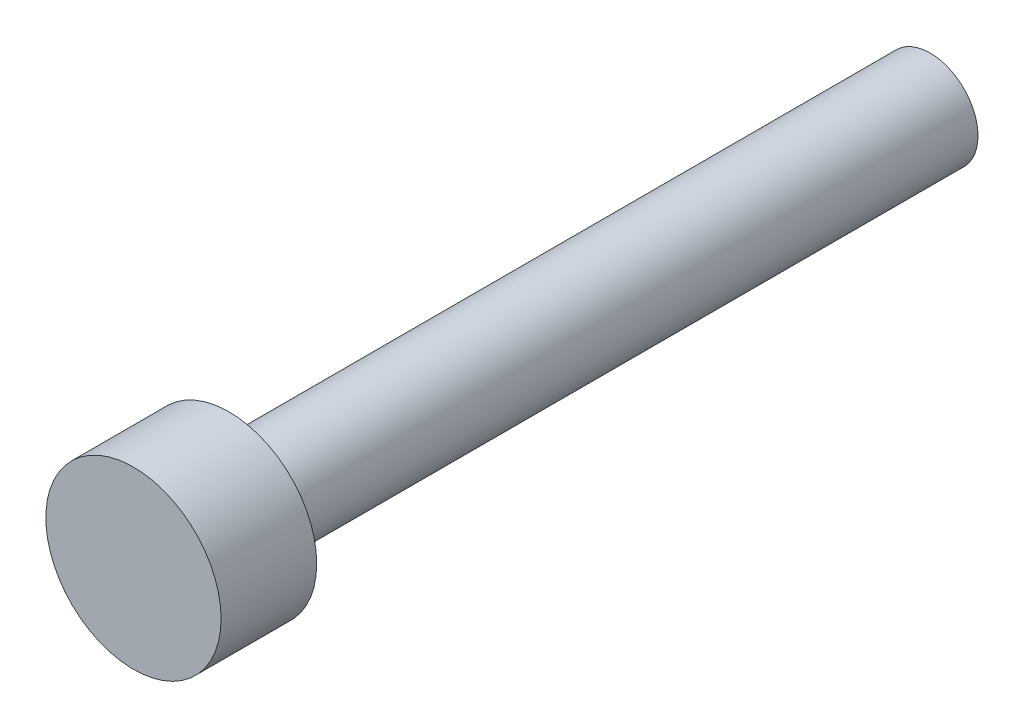
ISO-10303-21;
HEADER;
FILE_DESCRIPTION(('STEP AP214'),'2;1');
FILE_NAME('part.step','',(''),(''),'','','');
FILE_SCHEMA(('AUTOMOTIVE_DESIGN { 1 0 10303 214 1 1 1 1 }'));
ENDSEC;
DATA;
#1=APPLICATION_CONTEXT('core data for automotive mechanical design processes');
#2=APPLICATION_PROTOCOL_DEFINITION('international standard','automotive_design',2000,#1);
#3=PRODUCT_CONTEXT('',#1,'mechanical');
#4=PRODUCT('Part','Part','',(#3));
#5=PRODUCT_RELATED_PRODUCT_CATEGORY('part','',(#4));
#6=PRODUCT_DEFINITION_FORMATION('','',#4);
#7=PRODUCT_DEFINITION_CONTEXT('part definition',#1,'design');
#8=PRODUCT_DEFINITION('design','',#6,#7);
#9=PRODUCT_DEFINITION_SHAPE('','',#8);
#10=(LENGTH_UNIT() NAMED_UNIT(*) SI_UNIT(.MILLI.,.METRE.));
#11=(NAMED_UNIT(*) PLANE_ANGLE_UNIT() SI_UNIT($,.RADIAN.));
#12=(NAMED_UNIT(*) SI_UNIT($,.STERADIAN.) SOLID_ANGLE_UNIT());
#13=UNCERTAINTY_MEASURE_WITH_UNIT(LENGTH_MEASURE(1.E-05),#10,'distance_accuracy_value','');
#14=(GEOMETRIC_REPRESENTATION_CONTEXT(3) GLOBAL_UNCERTAINTY_ASSIGNED_CONTEXT((#13)) GLOBAL_UNIT_ASSIGNED_CONTEXT((#10,
#11,#12)) REPRESENTATION_CONTEXT('',''));
#15=CARTESIAN_POINT('',(0.,0.,0.));
#16=DIRECTION('',(0.,0.,1.));
#17=DIRECTION('',(1.,0.,0.));
#18=AXIS2_PLACEMENT_3D('',#15,#16,#17);
#19=CARTESIAN_POINT('',(0.,0.,0.));
#20=DIRECTION('',(0.,0.,-1.));
#21=DIRECTION('',(-1.,0.,0.));
#22=AXIS2_PLACEMENT_3D('',#19,#20,#21);
#23=CYLINDRICAL_SURFACE('',#22,1.5);
#24=CARTESIAN_POINT('',(0.,0.,0.));
#25=DIRECTION('',(0.,0.,1.));
#26=DIRECTION('',(1.,0.,0.));
#27=AXIS2_PLACEMENT_3D('',#24,#25,#26);
#28=CIRCLE('',#27,1.5);
#29=CARTESIAN_POINT('',(1.5,0.,0.));
#30=VERTEX_POINT('',#29);
#31=EDGE_CURVE('E10',#30,#30,#28,.T.);
#32=ORIENTED_EDGE('',*,*,#31,.F.);
#33=EDGE_LOOP('',(#32));
#34=FACE_BOUND('',#33,.T.);
#35=CARTESIAN_POINT('',(0.,0.,-22.));
#36=DIRECTION('',(0.,0.,1.));
#37=DIRECTION('',(1.,0.,0.));
#38=AXIS2_PLACEMENT_3D('',#35,#36,#37);
#39=CIRCLE('',#38,1.5);
#40=CARTESIAN_POINT('',(1.5,0.,-22.));
#41=VERTEX_POINT('',#40);
#42=EDGE_CURVE('E44',#41,#41,#39,.T.);
#43=ORIENTED_EDGE('',*,*,#42,.T.);
#44=EDGE_LOOP('',(#43));
#45=FACE_BOUND('',#44,.T.);
#46=ADVANCED_FACE('F41',(#34,#45),#23,.T.);
#47=CARTESIAN_POINT('',(0.,0.,-22.));
#48=DIRECTION('',(0.,0.,1.));
#49=DIRECTION('',(1.,0.,0.));
#50=AXIS2_PLACEMENT_3D('',#47,#48,#49);
#51=PLANE('',#50);
#52=ORIENTED_EDGE('',*,*,#42,.F.);
#53=EDGE_LOOP('',(#52));
#54=FACE_BOUND('',#53,.T.);
#55=ADVANCED_FACE('F64',(#54),#51,.F.);
#56=CARTESIAN_POINT('',(0.,0.,3.));
#57=DIRECTION('',(0.,0.,-1.));
#58=DIRECTION('',(-1.,0.,0.));
#59=AXIS2_PLACEMENT_3D('',#56,#57,#58);
#60=CYLINDRICAL_SURFACE('',#59,2.75);
#61=CARTESIAN_POINT('',(0.,0.,3.));
#62=DIRECTION('',(0.,0.,1.));
#63=DIRECTION('',(1.,0.,0.));
#64=AXIS2_PLACEMENT_3D('',#61,#62,#63);
#65=CIRCLE('',#64,2.75);
#66=CARTESIAN_POINT('',(2.75,0.,3.));
#67=VERTEX_POINT('',#66);
#68=EDGE_CURVE('E51',#67,#67,#65,.T.);
#69=ORIENTED_EDGE('',*,*,#68,.F.);
#70=EDGE_LOOP('',(#69));
#71=FACE_BOUND('',#70,.T.);
#72=CARTESIAN_POINT('',(0.,0.,0.));
#73=DIRECTION('',(0.,0.,1.));
#74=DIRECTION('',(1.,0.,0.));
#75=AXIS2_PLACEMENT_3D('',#72,#73,#74);
#76=CIRCLE('',#75,2.75);
#77=CARTESIAN_POINT('',(2.75,0.,0.));
#78=VERTEX_POINT('',#77);
#79=EDGE_CURVE('E53',#78,#78,#76,.T.);
#80=ORIENTED_EDGE('',*,*,#79,.T.);
#81=EDGE_LOOP('',(#80));
#82=FACE_BOUND('',#81,.T.);
#83=ADVANCED_FACE('F61',(#71,#82),#60,.T.);
#84=CARTESIAN_POINT('',(0.,0.,3.));
#85=DIRECTION('',(0.,0.,1.));
#86=DIRECTION('',(1.,0.,0.));
#87=AXIS2_PLACEMENT_3D('',#84,#85,#86);
#88=PLANE('',#87);
#89=ORIENTED_EDGE('',*,*,#68,.T.);
#90=EDGE_LOOP('',(#89));
#91=FACE_BOUND('',#90,.T.);
#92=ADVANCED_FACE('F59',(#91),#88,.T.);
#93=CARTESIAN_POINT('',(0.,0.,0.));
#94=DIRECTION('',(0.,0.,1.));
#95=DIRECTION('',(1.,0.,0.));
#96=AXIS2_PLACEMENT_3D('',#93,#94,#95);
#97=PLANE('',#96);
#98=ORIENTED_EDGE('',*,*,#31,.T.);
#99=EDGE_LOOP('',(#98));
#100=FACE_BOUND('',#99,.T.);
#101=ORIENTED_EDGE('',*,*,#79,.F.);
#102=EDGE_LOOP('',(#101));
#103=FACE_BOUND('',#102,.T.);
#104=ADVANCED_FACE('F68',(#100,#103),#97,.F.);
#105=CLOSED_SHELL('',(#46,#55,#83,#92,#104));
#106=MANIFOLD_SOLID_BREP('B2',#105);
#107=ADVANCED_BREP_SHAPE_REPRESENTATION('',(#18,#106),#14);
#108=SHAPE_DEFINITION_REPRESENTATION(#9,#107);
ENDSEC;
END-ISO-10303-21;
